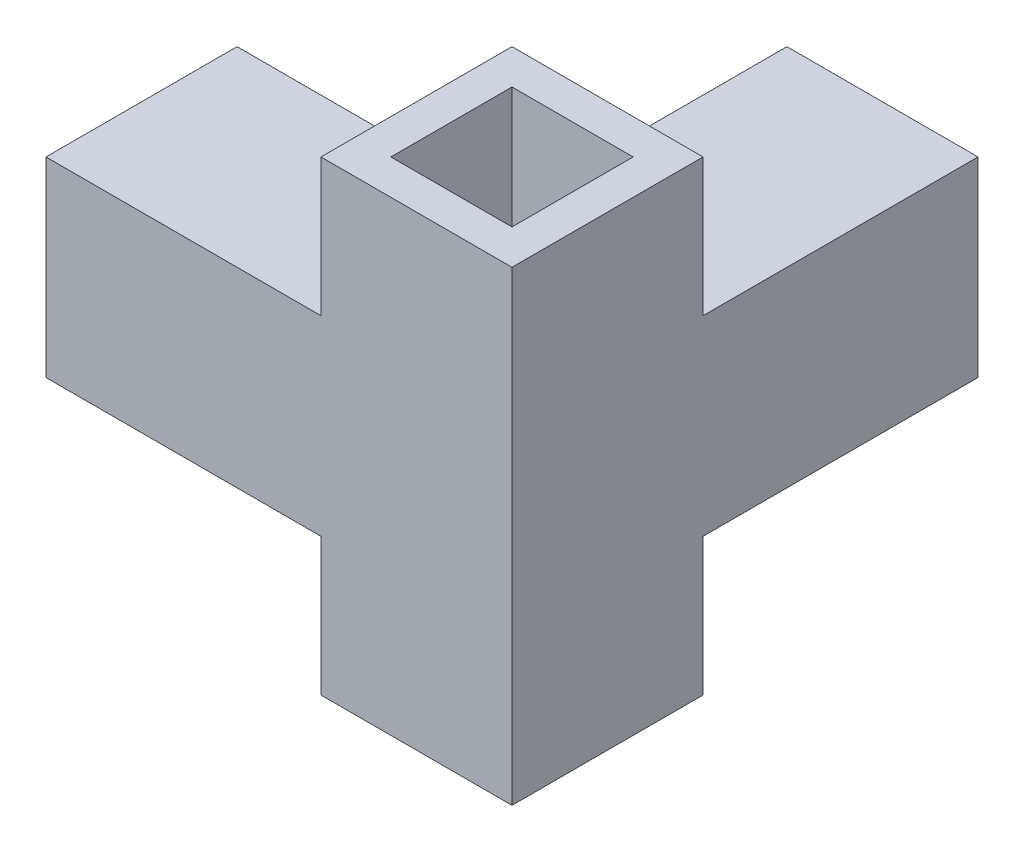
ISO-10303-21;
HEADER;
FILE_DESCRIPTION(('STEP AP214'),'2;1');
FILE_NAME('part.step','',(''),(''),'','','');
FILE_SCHEMA(('AUTOMOTIVE_DESIGN { 1 0 10303 214 1 1 1 1 }'));
ENDSEC;
DATA;
#1=APPLICATION_CONTEXT('core data for automotive mechanical design processes');
#2=APPLICATION_PROTOCOL_DEFINITION('international standard','automotive_design',2000,#1);
#3=PRODUCT_CONTEXT('',#1,'mechanical');
#4=PRODUCT('Part','Part','',(#3));
#5=PRODUCT_RELATED_PRODUCT_CATEGORY('part','',(#4));
#6=PRODUCT_DEFINITION_FORMATION('','',#4);
#7=PRODUCT_DEFINITION_CONTEXT('part definition',#1,'design');
#8=PRODUCT_DEFINITION('design','',#6,#7);
#9=PRODUCT_DEFINITION_SHAPE('','',#8);
#10=(LENGTH_UNIT() NAMED_UNIT(*) SI_UNIT(.MILLI.,.METRE.));
#11=(NAMED_UNIT(*) PLANE_ANGLE_UNIT() SI_UNIT($,.RADIAN.));
#12=(NAMED_UNIT(*) SI_UNIT($,.STERADIAN.) SOLID_ANGLE_UNIT());
#13=UNCERTAINTY_MEASURE_WITH_UNIT(LENGTH_MEASURE(1.E-05),#10,'distance_accuracy_value','');
#14=(GEOMETRIC_REPRESENTATION_CONTEXT(3) GLOBAL_UNCERTAINTY_ASSIGNED_CONTEXT((#13)) GLOBAL_UNIT_ASSIGNED_CONTEXT((#10,
#11,#12)) REPRESENTATION_CONTEXT('',''));
#15=CARTESIAN_POINT('',(0.,0.,0.));
#16=DIRECTION('',(0.,0.,1.));
#17=DIRECTION('',(1.,0.,0.));
#18=AXIS2_PLACEMENT_3D('',#15,#16,#17);
#19=CARTESIAN_POINT('',(0.,0.,0.));
#20=DIRECTION('',(-1.,0.,0.));
#21=DIRECTION('',(0.,0.,1.));
#22=AXIS2_PLACEMENT_3D('',#19,#20,#21);
#23=PLANE('',#22);
#24=DIRECTION('',(0.,0.,-1.));
#25=VECTOR('',#24,1.);
#26=CARTESIAN_POINT('',(0.,4.1,-8.2));
#27=LINE('',#26,#25);
#28=CARTESIAN_POINT('',(0.,4.1,0.));
#29=VERTEX_POINT('',#28);
#30=CARTESIAN_POINT('',(0.,4.1,-8.2));
#31=VERTEX_POINT('',#30);
#32=EDGE_CURVE('E69',#29,#31,#27,.T.);
#33=ORIENTED_EDGE('',*,*,#32,.F.);
#34=DIRECTION('',(0.,-1.,0.));
#35=VECTOR('',#34,1.);
#36=CARTESIAN_POINT('',(0.,10.,0.));
#37=LINE('',#36,#35);
#38=CARTESIAN_POINT('',(0.,10.,0.));
#39=VERTEX_POINT('',#38);
#40=EDGE_CURVE('E421',#39,#29,#37,.T.);
#41=ORIENTED_EDGE('',*,*,#40,.F.);
#42=DIRECTION('',(0.,0.,-1.));
#43=VECTOR('',#42,1.);
#44=CARTESIAN_POINT('',(0.,10.,0.));
#45=LINE('',#44,#43);
#46=CARTESIAN_POINT('',(0.,10.,-8.2));
#47=VERTEX_POINT('',#46);
#48=EDGE_CURVE('E416',#39,#47,#45,.T.);
#49=ORIENTED_EDGE('',*,*,#48,.T.);
#50=DIRECTION('',(0.,-1.,0.));
#51=VECTOR('',#50,1.);
#52=CARTESIAN_POINT('',(0.,10.,-8.2));
#53=LINE('',#52,#51);
#54=EDGE_CURVE('E413',#47,#31,#53,.T.);
#55=ORIENTED_EDGE('',*,*,#54,.T.);
#56=EDGE_LOOP('',(#33,#41,#49,#55));
#57=FACE_BOUND('',#56,.T.);
#58=ADVANCED_FACE('F45',(#57),#23,.T.);
#59=DIRECTION('',(0.,-1.,0.));
#60=VECTOR('',#59,1.);
#61=CARTESIAN_POINT('',(0.,4.1,-8.2));
#62=LINE('',#61,#60);
#63=CARTESIAN_POINT('',(0.,-4.1,-8.2));
#64=VERTEX_POINT('',#63);
#65=EDGE_CURVE('E243',#31,#64,#62,.T.);
#66=ORIENTED_EDGE('',*,*,#65,.F.);
#67=DIRECTION('',(0.,0.,-1.));
#68=VECTOR('',#67,1.);
#69=CARTESIAN_POINT('',(0.,4.1,-8.2));
#70=LINE('',#69,#68);
#71=CARTESIAN_POINT('',(0.,4.1,-20.));
#72=VERTEX_POINT('',#71);
#73=EDGE_CURVE('E409',#31,#72,#70,.T.);
#74=ORIENTED_EDGE('',*,*,#73,.T.);
#75=DIRECTION('',(0.,-1.,0.));
#76=VECTOR('',#75,1.);
#77=CARTESIAN_POINT('',(0.,4.1,-20.));
#78=LINE('',#77,#76);
#79=CARTESIAN_POINT('',(0.,-4.1,-20.));
#80=VERTEX_POINT('',#79);
#81=EDGE_CURVE('E405',#72,#80,#78,.T.);
#82=ORIENTED_EDGE('',*,*,#81,.T.);
#83=DIRECTION('',(0.,0.,-1.));
#84=VECTOR('',#83,1.);
#85=CARTESIAN_POINT('',(0.,-4.1,-8.2));
#86=LINE('',#85,#84);
#87=EDGE_CURVE('E339',#64,#80,#86,.T.);
#88=ORIENTED_EDGE('',*,*,#87,.F.);
#89=EDGE_LOOP('',(#66,#74,#82,#88));
#90=FACE_BOUND('',#89,.T.);
#91=ADVANCED_FACE('F463',(#90),#23,.T.);
#92=CARTESIAN_POINT('',(8.2,4.1,-20.));
#93=DIRECTION('',(0.,0.,-1.));
#94=DIRECTION('',(-1.,0.,0.));
#95=AXIS2_PLACEMENT_3D('',#92,#93,#94);
#96=PLANE('',#95);
#97=ORIENTED_EDGE('',*,*,#81,.F.);
#98=DIRECTION('',(-1.,0.,0.));
#99=VECTOR('',#98,1.);
#100=CARTESIAN_POINT('',(8.2,4.1,-20.));
#101=LINE('',#100,#99);
#102=CARTESIAN_POINT('',(8.2,4.1,-20.));
#103=VERTEX_POINT('',#102);
#104=EDGE_CURVE('E54',#103,#72,#101,.T.);
#105=ORIENTED_EDGE('',*,*,#104,.F.);
#106=DIRECTION('',(0.,-1.,0.));
#107=VECTOR('',#106,1.);
#108=CARTESIAN_POINT('',(8.2,4.1,-20.));
#109=LINE('',#108,#107);
#110=CARTESIAN_POINT('',(8.2,-4.1,-20.));
#111=VERTEX_POINT('',#110);
#112=EDGE_CURVE('E374',#103,#111,#109,.T.);
#113=ORIENTED_EDGE('',*,*,#112,.T.);
#114=DIRECTION('',(-1.,0.,0.));
#115=VECTOR('',#114,1.);
#116=CARTESIAN_POINT('',(8.2,-4.1,-20.));
#117=LINE('',#116,#115);
#118=EDGE_CURVE('E11',#111,#80,#117,.T.);
#119=ORIENTED_EDGE('',*,*,#118,.T.);
#120=EDGE_LOOP('',(#97,#105,#113,#119));
#121=FACE_BOUND('',#120,.T.);
#122=DIRECTION('',(-1.,0.,0.));
#123=VECTOR('',#122,1.);
#124=CARTESIAN_POINT('',(8.2,2.6,-20.));
#125=LINE('',#124,#123);
#126=CARTESIAN_POINT('',(6.7,2.6,-20.));
#127=VERTEX_POINT('',#126);
#128=CARTESIAN_POINT('',(1.5,2.6,-20.));
#129=VERTEX_POINT('',#128);
#130=EDGE_CURVE('E327',#127,#129,#125,.T.);
#131=ORIENTED_EDGE('',*,*,#130,.T.);
#132=DIRECTION('',(0.,-1.,0.));
#133=VECTOR('',#132,1.);
#134=CARTESIAN_POINT('',(1.5,0.,-20.));
#135=LINE('',#134,#133);
#136=CARTESIAN_POINT('',(1.5,-2.6,-20.));
#137=VERTEX_POINT('',#136);
#138=EDGE_CURVE('E286',#129,#137,#135,.T.);
#139=ORIENTED_EDGE('',*,*,#138,.T.);
#140=DIRECTION('',(-1.,0.,0.));
#141=VECTOR('',#140,1.);
#142=CARTESIAN_POINT('',(8.2,-2.6,-20.));
#143=LINE('',#142,#141);
#144=CARTESIAN_POINT('',(6.7,-2.6,-20.));
#145=VERTEX_POINT('',#144);
#146=EDGE_CURVE('E336',#145,#137,#143,.T.);
#147=ORIENTED_EDGE('',*,*,#146,.F.);
#148=DIRECTION('',(0.,-1.,0.));
#149=VECTOR('',#148,1.);
#150=CARTESIAN_POINT('',(6.7,0.,-20.));
#151=LINE('',#150,#149);
#152=EDGE_CURVE('E291',#127,#145,#151,.T.);
#153=ORIENTED_EDGE('',*,*,#152,.F.);
#154=EDGE_LOOP('',(#131,#139,#147,#153));
#155=FACE_BOUND('',#154,.T.);
#156=ADVANCED_FACE('F458',(#121,#155),#96,.T.);
#157=CARTESIAN_POINT('',(8.2,10.,0.));
#158=DIRECTION('',(0.,1.,0.));
#159=DIRECTION('',(0.,0.,1.));
#160=AXIS2_PLACEMENT_3D('',#157,#158,#159);
#161=PLANE('',#160);
#162=ORIENTED_EDGE('',*,*,#48,.F.);
#163=DIRECTION('',(-1.,0.,0.));
#164=VECTOR('',#163,1.);
#165=CARTESIAN_POINT('',(8.2,10.,0.));
#166=LINE('',#165,#164);
#167=CARTESIAN_POINT('',(8.2,10.,0.));
#168=VERTEX_POINT('',#167);
#169=EDGE_CURVE('E441',#168,#39,#166,.T.);
#170=ORIENTED_EDGE('',*,*,#169,.F.);
#171=DIRECTION('',(0.,0.,-1.));
#172=VECTOR('',#171,1.);
#173=CARTESIAN_POINT('',(8.2,10.,0.));
#174=LINE('',#173,#172);
#175=CARTESIAN_POINT('',(8.2,10.,-8.2));
#176=VERTEX_POINT('',#175);
#177=EDGE_CURVE('E387',#168,#176,#174,.T.);
#178=ORIENTED_EDGE('',*,*,#177,.T.);
#179=DIRECTION('',(-1.,0.,0.));
#180=VECTOR('',#179,1.);
#181=CARTESIAN_POINT('',(8.2,10.,-8.2));
#182=LINE('',#181,#180);
#183=EDGE_CURVE('E444',#176,#47,#182,.T.);
#184=ORIENTED_EDGE('',*,*,#183,.T.);
#185=EDGE_LOOP('',(#162,#170,#178,#184));
#186=FACE_BOUND('',#185,.T.);
#187=DIRECTION('',(-1.,0.,0.));
#188=VECTOR('',#187,1.);
#189=CARTESIAN_POINT('',(8.2,10.,-1.5));
#190=LINE('',#189,#188);
#191=CARTESIAN_POINT('',(6.7,10.,-1.5));
#192=VERTEX_POINT('',#191);
#193=CARTESIAN_POINT('',(1.5,10.,-1.5));
#194=VERTEX_POINT('',#193);
#195=EDGE_CURVE('E358',#192,#194,#190,.T.);
#196=ORIENTED_EDGE('',*,*,#195,.T.);
#197=DIRECTION('',(0.,0.,-1.));
#198=VECTOR('',#197,1.);
#199=CARTESIAN_POINT('',(1.5,10.,0.));
#200=LINE('',#199,#198);
#201=CARTESIAN_POINT('',(1.5,10.,-6.7));
#202=VERTEX_POINT('',#201);
#203=EDGE_CURVE('E332',#194,#202,#200,.T.);
#204=ORIENTED_EDGE('',*,*,#203,.T.);
#205=DIRECTION('',(-1.,0.,0.));
#206=VECTOR('',#205,1.);
#207=CARTESIAN_POINT('',(8.2,10.,-6.7));
#208=LINE('',#207,#206);
#209=CARTESIAN_POINT('',(6.7,10.,-6.7));
#210=VERTEX_POINT('',#209);
#211=EDGE_CURVE('E328',#210,#202,#208,.T.);
#212=ORIENTED_EDGE('',*,*,#211,.F.);
#213=DIRECTION('',(0.,0.,-1.));
#214=VECTOR('',#213,1.);
#215=CARTESIAN_POINT('',(6.7,10.,0.));
#216=LINE('',#215,#214);
#217=EDGE_CURVE('E314',#192,#210,#216,.T.);
#218=ORIENTED_EDGE('',*,*,#217,.F.);
#219=EDGE_LOOP('',(#196,#204,#212,#218));
#220=FACE_BOUND('',#219,.T.);
#221=ADVANCED_FACE('F498',(#186,#220),#161,.T.);
#222=CARTESIAN_POINT('',(8.2,-10.,0.));
#223=DIRECTION('',(0.,1.,0.));
#224=DIRECTION('',(0.,0.,1.));
#225=AXIS2_PLACEMENT_3D('',#222,#223,#224);
#226=PLANE('',#225);
#227=DIRECTION('',(0.,0.,-1.));
#228=VECTOR('',#227,1.);
#229=CARTESIAN_POINT('',(0.,-10.,0.));
#230=LINE('',#229,#228);
#231=CARTESIAN_POINT('',(0.,-10.,0.));
#232=VERTEX_POINT('',#231);
#233=CARTESIAN_POINT('',(0.,-10.,-8.2));
#234=VERTEX_POINT('',#233);
#235=EDGE_CURVE('E424',#232,#234,#230,.T.);
#236=ORIENTED_EDGE('',*,*,#235,.T.);
#237=DIRECTION('',(-1.,0.,0.));
#238=VECTOR('',#237,1.);
#239=CARTESIAN_POINT('',(8.2,-10.,-8.2));
#240=LINE('',#239,#238);
#241=CARTESIAN_POINT('',(8.2,-10.,-8.2));
#242=VERTEX_POINT('',#241);
#243=EDGE_CURVE('E434',#242,#234,#240,.T.);
#244=ORIENTED_EDGE('',*,*,#243,.F.);
#245=DIRECTION('',(0.,0.,-1.));
#246=VECTOR('',#245,1.);
#247=CARTESIAN_POINT('',(8.2,-10.,0.));
#248=LINE('',#247,#246);
#249=CARTESIAN_POINT('',(8.2,-10.,0.));
#250=VERTEX_POINT('',#249);
#251=EDGE_CURVE('E394',#250,#242,#248,.T.);
#252=ORIENTED_EDGE('',*,*,#251,.F.);
#253=DIRECTION('',(-1.,0.,0.));
#254=VECTOR('',#253,1.);
#255=CARTESIAN_POINT('',(8.2,-10.,0.));
#256=LINE('',#255,#254);
#257=EDGE_CURVE('E437',#250,#232,#256,.T.);
#258=ORIENTED_EDGE('',*,*,#257,.T.);
#259=EDGE_LOOP('',(#236,#244,#252,#258));
#260=FACE_BOUND('',#259,.T.);
#261=DIRECTION('',(0.,0.,-1.));
#262=VECTOR('',#261,1.);
#263=CARTESIAN_POINT('',(1.5,-10.,0.));
#264=LINE('',#263,#262);
#265=CARTESIAN_POINT('',(1.5,-10.,-1.5));
#266=VERTEX_POINT('',#265);
#267=CARTESIAN_POINT('',(1.5,-10.,-6.7));
#268=VERTEX_POINT('',#267);
#269=EDGE_CURVE('E301',#266,#268,#264,.T.);
#270=ORIENTED_EDGE('',*,*,#269,.F.);
#271=DIRECTION('',(-1.,0.,0.));
#272=VECTOR('',#271,1.);
#273=CARTESIAN_POINT('',(8.2,-10.,-1.5));
#274=LINE('',#273,#272);
#275=CARTESIAN_POINT('',(6.7,-10.,-1.5));
#276=VERTEX_POINT('',#275);
#277=EDGE_CURVE('E351',#276,#266,#274,.T.);
#278=ORIENTED_EDGE('',*,*,#277,.F.);
#279=DIRECTION('',(0.,0.,-1.));
#280=VECTOR('',#279,1.);
#281=CARTESIAN_POINT('',(6.7,-10.,0.));
#282=LINE('',#281,#280);
#283=CARTESIAN_POINT('',(6.7,-10.,-6.7));
#284=VERTEX_POINT('',#283);
#285=EDGE_CURVE('E305',#276,#284,#282,.T.);
#286=ORIENTED_EDGE('',*,*,#285,.T.);
#287=DIRECTION('',(-1.,0.,0.));
#288=VECTOR('',#287,1.);
#289=CARTESIAN_POINT('',(8.2,-10.,-6.7));
#290=LINE('',#289,#288);
#291=EDGE_CURVE('E296',#284,#268,#290,.T.);
#292=ORIENTED_EDGE('',*,*,#291,.T.);
#293=EDGE_LOOP('',(#270,#278,#286,#292));
#294=FACE_BOUND('',#293,.T.);
#295=ADVANCED_FACE('F503',(#260,#294),#226,.F.);
#296=CARTESIAN_POINT('',(8.2,-4.1,-8.2));
#297=DIRECTION('',(0.,1.,0.));
#298=DIRECTION('',(0.,0.,1.));
#299=AXIS2_PLACEMENT_3D('',#296,#297,#298);
#300=PLANE('',#299);
#301=ORIENTED_EDGE('',*,*,#87,.T.);
#302=ORIENTED_EDGE('',*,*,#118,.F.);
#303=DIRECTION('',(0.,0.,-1.));
#304=VECTOR('',#303,1.);
#305=CARTESIAN_POINT('',(8.2,-4.1,-8.2));
#306=LINE('',#305,#304);
#307=CARTESIAN_POINT('',(8.2,-4.1,-8.2));
#308=VERTEX_POINT('',#307);
#309=EDGE_CURVE('E371',#308,#111,#306,.T.);
#310=ORIENTED_EDGE('',*,*,#309,.F.);
#311=DIRECTION('',(-1.,0.,0.));
#312=VECTOR('',#311,1.);
#313=CARTESIAN_POINT('',(8.2,-4.1,-8.2));
#314=LINE('',#313,#312);
#315=EDGE_CURVE('E401',#308,#64,#314,.T.);
#316=ORIENTED_EDGE('',*,*,#315,.T.);
#317=EDGE_LOOP('',(#301,#302,#310,#316));
#318=FACE_BOUND('',#317,.T.);
#319=ADVANCED_FACE('F47',(#318),#300,.F.);
#320=CARTESIAN_POINT('',(8.2,4.1,-8.2));
#321=DIRECTION('',(0.,1.,0.));
#322=DIRECTION('',(0.,0.,1.));
#323=AXIS2_PLACEMENT_3D('',#320,#321,#322);
#324=PLANE('',#323);
#325=ORIENTED_EDGE('',*,*,#73,.F.);
#326=DIRECTION('',(-1.,0.,0.));
#327=VECTOR('',#326,1.);
#328=CARTESIAN_POINT('',(8.2,4.1,-8.2));
#329=LINE('',#328,#327);
#330=CARTESIAN_POINT('',(8.2,4.1,-8.2));
#331=VERTEX_POINT('',#330);
#332=EDGE_CURVE('E447',#331,#31,#329,.T.);
#333=ORIENTED_EDGE('',*,*,#332,.F.);
#334=DIRECTION('',(0.,0.,-1.));
#335=VECTOR('',#334,1.);
#336=CARTESIAN_POINT('',(8.2,4.1,-8.2));
#337=LINE('',#336,#335);
#338=EDGE_CURVE('E379',#331,#103,#337,.T.);
#339=ORIENTED_EDGE('',*,*,#338,.T.);
#340=ORIENTED_EDGE('',*,*,#104,.T.);
#341=EDGE_LOOP('',(#325,#333,#339,#340));
#342=FACE_BOUND('',#341,.T.);
#343=ADVANCED_FACE('F454',(#342),#324,.T.);
#344=CARTESIAN_POINT('',(8.2,10.,-8.2));
#345=DIRECTION('',(0.,0.,-1.));
#346=DIRECTION('',(0.,1.,0.));
#347=AXIS2_PLACEMENT_3D('',#344,#345,#346);
#348=PLANE('',#347);
#349=ORIENTED_EDGE('',*,*,#54,.F.);
#350=ORIENTED_EDGE('',*,*,#183,.F.);
#351=DIRECTION('',(0.,-1.,0.));
#352=VECTOR('',#351,1.);
#353=CARTESIAN_POINT('',(8.2,10.,-8.2));
#354=LINE('',#353,#352);
#355=EDGE_CURVE('E383',#176,#331,#354,.T.);
#356=ORIENTED_EDGE('',*,*,#355,.T.);
#357=ORIENTED_EDGE('',*,*,#332,.T.);
#358=EDGE_LOOP('',(#349,#350,#356,#357));
#359=FACE_BOUND('',#358,.T.);
#360=ADVANCED_FACE('F469',(#359),#348,.T.);
#361=CARTESIAN_POINT('',(8.2,10.,0.));
#362=DIRECTION('',(0.,0.,-1.));
#363=DIRECTION('',(-1.,0.,0.));
#364=AXIS2_PLACEMENT_3D('',#361,#362,#363);
#365=PLANE('',#364);
#366=ORIENTED_EDGE('',*,*,#40,.T.);
#367=DIRECTION('',(1.,0.,0.));
#368=VECTOR('',#367,1.);
#369=CARTESIAN_POINT('',(-11.8,4.1,0.));
#370=LINE('',#369,#368);
#371=CARTESIAN_POINT('',(-11.8,4.1,0.));
#372=VERTEX_POINT('',#371);
#373=EDGE_CURVE('E270',#372,#29,#370,.T.);
#374=ORIENTED_EDGE('',*,*,#373,.F.);
#375=DIRECTION('',(0.,1.,0.));
#376=VECTOR('',#375,1.);
#377=CARTESIAN_POINT('',(-11.8,4.1,0.));
#378=LINE('',#377,#376);
#379=CARTESIAN_POINT('',(-11.8,-4.1,0.));
#380=VERTEX_POINT('',#379);
#381=EDGE_CURVE('E251',#380,#372,#378,.T.);
#382=ORIENTED_EDGE('',*,*,#381,.F.);
#383=DIRECTION('',(1.,0.,0.));
#384=VECTOR('',#383,1.);
#385=CARTESIAN_POINT('',(-11.8,-4.1,0.));
#386=LINE('',#385,#384);
#387=CARTESIAN_POINT('',(0.,-4.1,0.));
#388=VERTEX_POINT('',#387);
#389=EDGE_CURVE('E274',#380,#388,#386,.T.);
#390=ORIENTED_EDGE('',*,*,#389,.T.);
#391=EDGE_CURVE('E420',#388,#232,#37,.T.);
#392=ORIENTED_EDGE('',*,*,#391,.T.);
#393=ORIENTED_EDGE('',*,*,#257,.F.);
#394=DIRECTION('',(0.,-1.,0.));
#395=VECTOR('',#394,1.);
#396=CARTESIAN_POINT('',(8.2,10.,0.));
#397=LINE('',#396,#395);
#398=EDGE_CURVE('E391',#168,#250,#397,.T.);
#399=ORIENTED_EDGE('',*,*,#398,.F.);
#400=ORIENTED_EDGE('',*,*,#169,.T.);
#401=EDGE_LOOP('',(#366,#374,#382,#390,#392,#393,#399,#400));
#402=FACE_BOUND('',#401,.T.);
#403=ADVANCED_FACE('F494',(#402),#365,.F.);
#404=CARTESIAN_POINT('',(8.2,-4.1,-8.2));
#405=DIRECTION('',(0.,0.,-1.));
#406=DIRECTION('',(-1.,0.,0.));
#407=AXIS2_PLACEMENT_3D('',#404,#405,#406);
#408=PLANE('',#407);
#409=DIRECTION('',(0.,-1.,0.));
#410=VECTOR('',#409,1.);
#411=CARTESIAN_POINT('',(0.,-4.1,-8.2));
#412=LINE('',#411,#410);
#413=EDGE_CURVE('E375',#64,#234,#412,.T.);
#414=ORIENTED_EDGE('',*,*,#413,.F.);
#415=ORIENTED_EDGE('',*,*,#315,.F.);
#416=DIRECTION('',(0.,-1.,0.));
#417=VECTOR('',#416,1.);
#418=CARTESIAN_POINT('',(8.2,-4.1,-8.2));
#419=LINE('',#418,#417);
#420=EDGE_CURVE('E397',#308,#242,#419,.T.);
#421=ORIENTED_EDGE('',*,*,#420,.T.);
#422=ORIENTED_EDGE('',*,*,#243,.T.);
#423=EDGE_LOOP('',(#414,#415,#421,#422));
#424=FACE_BOUND('',#423,.T.);
#425=ADVANCED_FACE('F478',(#424),#408,.T.);
#426=CARTESIAN_POINT('',(8.2,0.,0.));
#427=DIRECTION('',(-1.,0.,0.));
#428=DIRECTION('',(0.,0.,1.));
#429=AXIS2_PLACEMENT_3D('',#426,#427,#428);
#430=PLANE('',#429);
#431=ORIENTED_EDGE('',*,*,#309,.T.);
#432=ORIENTED_EDGE('',*,*,#112,.F.);
#433=ORIENTED_EDGE('',*,*,#338,.F.);
#434=ORIENTED_EDGE('',*,*,#355,.F.);
#435=ORIENTED_EDGE('',*,*,#177,.F.);
#436=ORIENTED_EDGE('',*,*,#398,.T.);
#437=ORIENTED_EDGE('',*,*,#251,.T.);
#438=ORIENTED_EDGE('',*,*,#420,.F.);
#439=EDGE_LOOP('',(#431,#432,#433,#434,#435,#436,#437,#438));
#440=FACE_BOUND('',#439,.T.);
#441=ADVANCED_FACE('F472',(#440),#430,.F.);
#442=DIRECTION('',(0.,0.,1.));
#443=VECTOR('',#442,1.);
#444=CARTESIAN_POINT('',(0.,-4.1,-8.2));
#445=LINE('',#444,#443);
#446=EDGE_CURVE('E261',#64,#388,#445,.T.);
#447=ORIENTED_EDGE('',*,*,#446,.F.);
#448=ORIENTED_EDGE('',*,*,#413,.T.);
#449=ORIENTED_EDGE('',*,*,#235,.F.);
#450=ORIENTED_EDGE('',*,*,#391,.F.);
#451=EDGE_LOOP('',(#447,#448,#449,#450));
#452=FACE_BOUND('',#451,.T.);
#453=ADVANCED_FACE('F505',(#452),#23,.T.);
#454=CARTESIAN_POINT('',(8.2,-2.6,-8.2));
#455=DIRECTION('',(0.,1.,0.));
#456=DIRECTION('',(0.,0.,1.));
#457=AXIS2_PLACEMENT_3D('',#454,#455,#456);
#458=PLANE('',#457);
#459=DIRECTION('',(0.,0.,-1.));
#460=VECTOR('',#459,1.);
#461=CARTESIAN_POINT('',(1.5,-2.6,0.));
#462=LINE('',#461,#460);
#463=CARTESIAN_POINT('',(1.5,-2.6,-6.7));
#464=VERTEX_POINT('',#463);
#465=EDGE_CURVE('E282',#464,#137,#462,.T.);
#466=ORIENTED_EDGE('',*,*,#465,.F.);
#467=DIRECTION('',(-1.,0.,0.));
#468=VECTOR('',#467,1.);
#469=CARTESIAN_POINT('',(8.2,-2.6,-6.7));
#470=LINE('',#469,#468);
#471=CARTESIAN_POINT('',(6.7,-2.6,-6.7));
#472=VERTEX_POINT('',#471);
#473=EDGE_CURVE('E293',#472,#464,#470,.T.);
#474=ORIENTED_EDGE('',*,*,#473,.F.);
#475=DIRECTION('',(0.,0.,-1.));
#476=VECTOR('',#475,1.);
#477=CARTESIAN_POINT('',(6.7,-2.6,0.));
#478=LINE('',#477,#476);
#479=EDGE_CURVE('E287',#472,#145,#478,.T.);
#480=ORIENTED_EDGE('',*,*,#479,.T.);
#481=ORIENTED_EDGE('',*,*,#146,.T.);
#482=EDGE_LOOP('',(#466,#474,#480,#481));
#483=FACE_BOUND('',#482,.T.);
#484=ADVANCED_FACE('F543',(#483),#458,.T.);
#485=CARTESIAN_POINT('',(8.2,2.6,-8.2));
#486=DIRECTION('',(0.,1.,0.));
#487=DIRECTION('',(0.,0.,1.));
#488=AXIS2_PLACEMENT_3D('',#485,#486,#487);
#489=PLANE('',#488);
#490=DIRECTION('',(0.,0.,-1.));
#491=VECTOR('',#490,1.);
#492=CARTESIAN_POINT('',(1.5,2.6,0.));
#493=LINE('',#492,#491);
#494=CARTESIAN_POINT('',(1.5,2.6,-6.7));
#495=VERTEX_POINT('',#494);
#496=EDGE_CURVE('E319',#495,#129,#493,.T.);
#497=ORIENTED_EDGE('',*,*,#496,.T.);
#498=ORIENTED_EDGE('',*,*,#130,.F.);
#499=DIRECTION('',(0.,0.,-1.));
#500=VECTOR('',#499,1.);
#501=CARTESIAN_POINT('',(6.7,2.6,0.));
#502=LINE('',#501,#500);
#503=CARTESIAN_POINT('',(6.7,2.6,-6.7));
#504=VERTEX_POINT('',#503);
#505=EDGE_CURVE('E306',#504,#127,#502,.T.);
#506=ORIENTED_EDGE('',*,*,#505,.F.);
#507=DIRECTION('',(-1.,0.,0.));
#508=VECTOR('',#507,1.);
#509=CARTESIAN_POINT('',(8.2,2.6,-6.7));
#510=LINE('',#509,#508);
#511=EDGE_CURVE('E324',#504,#495,#510,.T.);
#512=ORIENTED_EDGE('',*,*,#511,.T.);
#513=EDGE_LOOP('',(#497,#498,#506,#512));
#514=FACE_BOUND('',#513,.T.);
#515=ADVANCED_FACE('F549',(#514),#489,.F.);
#516=CARTESIAN_POINT('',(8.2,10.,-6.7));
#517=DIRECTION('',(0.,0.,-1.));
#518=DIRECTION('',(0.,1.,0.));
#519=AXIS2_PLACEMENT_3D('',#516,#517,#518);
#520=PLANE('',#519);
#521=DIRECTION('',(0.,-1.,0.));
#522=VECTOR('',#521,1.);
#523=CARTESIAN_POINT('',(1.5,0.,-6.7));
#524=LINE('',#523,#522);
#525=EDGE_CURVE('E323',#202,#495,#524,.T.);
#526=ORIENTED_EDGE('',*,*,#525,.T.);
#527=ORIENTED_EDGE('',*,*,#511,.F.);
#528=DIRECTION('',(0.,-1.,0.));
#529=VECTOR('',#528,1.);
#530=CARTESIAN_POINT('',(6.7,0.,-6.7));
#531=LINE('',#530,#529);
#532=EDGE_CURVE('E310',#210,#504,#531,.T.);
#533=ORIENTED_EDGE('',*,*,#532,.F.);
#534=ORIENTED_EDGE('',*,*,#211,.T.);
#535=EDGE_LOOP('',(#526,#527,#533,#534));
#536=FACE_BOUND('',#535,.T.);
#537=ADVANCED_FACE('F571',(#536),#520,.F.);
#538=CARTESIAN_POINT('',(8.2,10.,-1.5));
#539=DIRECTION('',(0.,0.,-1.));
#540=DIRECTION('',(-1.,0.,0.));
#541=AXIS2_PLACEMENT_3D('',#538,#539,#540);
#542=PLANE('',#541);
#543=DIRECTION('',(0.,-1.,0.));
#544=VECTOR('',#543,1.);
#545=CARTESIAN_POINT('',(1.5,0.,-1.5));
#546=LINE('',#545,#544);
#547=EDGE_CURVE('E333',#194,#266,#546,.T.);
#548=ORIENTED_EDGE('',*,*,#547,.F.);
#549=ORIENTED_EDGE('',*,*,#195,.F.);
#550=DIRECTION('',(0.,-1.,0.));
#551=VECTOR('',#550,1.);
#552=CARTESIAN_POINT('',(6.7,0.,-1.5));
#553=LINE('',#552,#551);
#554=EDGE_CURVE('E315',#192,#276,#553,.T.);
#555=ORIENTED_EDGE('',*,*,#554,.T.);
#556=ORIENTED_EDGE('',*,*,#277,.T.);
#557=EDGE_LOOP('',(#548,#549,#555,#556));
#558=FACE_BOUND('',#557,.T.);
#559=ADVANCED_FACE('F567',(#558),#542,.T.);
#560=CARTESIAN_POINT('',(8.2,-4.1,-6.7));
#561=DIRECTION('',(0.,0.,-1.));
#562=DIRECTION('',(-1.,0.,0.));
#563=AXIS2_PLACEMENT_3D('',#560,#561,#562);
#564=PLANE('',#563);
#565=DIRECTION('',(0.,-1.,0.));
#566=VECTOR('',#565,1.);
#567=CARTESIAN_POINT('',(1.5,0.,-6.7));
#568=LINE('',#567,#566);
#569=EDGE_CURVE('E292',#464,#268,#568,.T.);
#570=ORIENTED_EDGE('',*,*,#569,.T.);
#571=ORIENTED_EDGE('',*,*,#291,.F.);
#572=DIRECTION('',(0.,-1.,0.));
#573=VECTOR('',#572,1.);
#574=CARTESIAN_POINT('',(6.7,0.,-6.7));
#575=LINE('',#574,#573);
#576=EDGE_CURVE('E297',#472,#284,#575,.T.);
#577=ORIENTED_EDGE('',*,*,#576,.F.);
#578=ORIENTED_EDGE('',*,*,#473,.T.);
#579=EDGE_LOOP('',(#570,#571,#577,#578));
#580=FACE_BOUND('',#579,.T.);
#581=ADVANCED_FACE('F563',(#580),#564,.F.);
#582=CARTESIAN_POINT('',(6.7,0.,0.));
#583=DIRECTION('',(-1.,0.,0.));
#584=DIRECTION('',(0.,0.,1.));
#585=AXIS2_PLACEMENT_3D('',#582,#583,#584);
#586=PLANE('',#585);
#587=ORIENTED_EDGE('',*,*,#479,.F.);
#588=ORIENTED_EDGE('',*,*,#576,.T.);
#589=ORIENTED_EDGE('',*,*,#285,.F.);
#590=ORIENTED_EDGE('',*,*,#554,.F.);
#591=ORIENTED_EDGE('',*,*,#217,.T.);
#592=ORIENTED_EDGE('',*,*,#532,.T.);
#593=ORIENTED_EDGE('',*,*,#505,.T.);
#594=ORIENTED_EDGE('',*,*,#152,.T.);
#595=EDGE_LOOP('',(#587,#588,#589,#590,#591,#592,#593,#594));
#596=FACE_BOUND('',#595,.T.);
#597=ADVANCED_FACE('F559',(#596),#586,.T.);
#598=CARTESIAN_POINT('',(1.5,0.,0.));
#599=DIRECTION('',(-1.,0.,0.));
#600=DIRECTION('',(0.,0.,1.));
#601=AXIS2_PLACEMENT_3D('',#598,#599,#600);
#602=PLANE('',#601);
#603=ORIENTED_EDGE('',*,*,#465,.T.);
#604=ORIENTED_EDGE('',*,*,#138,.F.);
#605=ORIENTED_EDGE('',*,*,#496,.F.);
#606=ORIENTED_EDGE('',*,*,#525,.F.);
#607=ORIENTED_EDGE('',*,*,#203,.F.);
#608=ORIENTED_EDGE('',*,*,#547,.T.);
#609=ORIENTED_EDGE('',*,*,#269,.T.);
#610=ORIENTED_EDGE('',*,*,#569,.F.);
#611=EDGE_LOOP('',(#603,#604,#605,#606,#607,#608,#609,#610));
#612=FACE_BOUND('',#611,.T.);
#613=ADVANCED_FACE('F557',(#612),#602,.F.);
#614=CARTESIAN_POINT('',(-11.8,4.1,-8.2));
#615=DIRECTION('',(0.,0.,1.));
#616=DIRECTION('',(0.,-1.,0.));
#617=AXIS2_PLACEMENT_3D('',#614,#615,#616);
#618=PLANE('',#617);
#619=ORIENTED_EDGE('',*,*,#65,.T.);
#620=DIRECTION('',(1.,0.,0.));
#621=VECTOR('',#620,1.);
#622=CARTESIAN_POINT('',(-11.8,-4.1,-8.2));
#623=LINE('',#622,#621);
#624=CARTESIAN_POINT('',(-11.8,-4.1,-8.2));
#625=VERTEX_POINT('',#624);
#626=EDGE_CURVE('E278',#625,#64,#623,.T.);
#627=ORIENTED_EDGE('',*,*,#626,.F.);
#628=DIRECTION('',(0.,-1.,0.));
#629=VECTOR('',#628,1.);
#630=CARTESIAN_POINT('',(-11.8,4.1,-8.2));
#631=LINE('',#630,#629);
#632=CARTESIAN_POINT('',(-11.8,4.1,-8.2));
#633=VERTEX_POINT('',#632);
#634=EDGE_CURVE('E244',#633,#625,#631,.T.);
#635=ORIENTED_EDGE('',*,*,#634,.F.);
#636=DIRECTION('',(1.,0.,0.));
#637=VECTOR('',#636,1.);
#638=CARTESIAN_POINT('',(-11.8,4.1,-8.2));
#639=LINE('',#638,#637);
#640=EDGE_CURVE('E257',#633,#31,#639,.T.);
#641=ORIENTED_EDGE('',*,*,#640,.T.);
#642=EDGE_LOOP('',(#619,#627,#635,#641));
#643=FACE_BOUND('',#642,.T.);
#644=ADVANCED_FACE('F486',(#643),#618,.F.);
#645=CARTESIAN_POINT('',(-11.8,-4.1,-8.2));
#646=DIRECTION('',(0.,1.,0.));
#647=DIRECTION('',(0.,0.,1.));
#648=AXIS2_PLACEMENT_3D('',#645,#646,#647);
#649=PLANE('',#648);
#650=ORIENTED_EDGE('',*,*,#446,.T.);
#651=ORIENTED_EDGE('',*,*,#389,.F.);
#652=DIRECTION('',(0.,0.,1.));
#653=VECTOR('',#652,1.);
#654=CARTESIAN_POINT('',(-11.8,-4.1,-8.2));
#655=LINE('',#654,#653);
#656=EDGE_CURVE('E248',#625,#380,#655,.T.);
#657=ORIENTED_EDGE('',*,*,#656,.F.);
#658=ORIENTED_EDGE('',*,*,#626,.T.);
#659=EDGE_LOOP('',(#650,#651,#657,#658));
#660=FACE_BOUND('',#659,.T.);
#661=ADVANCED_FACE('F483',(#660),#649,.F.);
#662=CARTESIAN_POINT('',(-11.8,4.1,-8.2));
#663=DIRECTION('',(0.,-1.,0.));
#664=DIRECTION('',(0.,0.,-1.));
#665=AXIS2_PLACEMENT_3D('',#662,#663,#664);
#666=PLANE('',#665);
#667=ORIENTED_EDGE('',*,*,#32,.T.);
#668=ORIENTED_EDGE('',*,*,#640,.F.);
#669=DIRECTION('',(0.,0.,-1.));
#670=VECTOR('',#669,1.);
#671=CARTESIAN_POINT('',(-11.8,4.1,-8.2));
#672=LINE('',#671,#670);
#673=EDGE_CURVE('E254',#372,#633,#672,.T.);
#674=ORIENTED_EDGE('',*,*,#673,.F.);
#675=ORIENTED_EDGE('',*,*,#373,.T.);
#676=EDGE_LOOP('',(#667,#668,#674,#675));
#677=FACE_BOUND('',#676,.T.);
#678=ADVANCED_FACE('F492',(#677),#666,.F.);
#679=CARTESIAN_POINT('',(-11.8,0.,0.));
#680=DIRECTION('',(-1.,0.,0.));
#681=DIRECTION('',(0.,0.,1.));
#682=AXIS2_PLACEMENT_3D('',#679,#680,#681);
#683=PLANE('',#682);
#684=DIRECTION('',(0.,-1.,0.));
#685=VECTOR('',#684,1.);
#686=CARTESIAN_POINT('',(-11.8,4.1,-6.7));
#687=LINE('',#686,#685);
#688=CARTESIAN_POINT('',(-11.8,2.6,-6.7));
#689=VERTEX_POINT('',#688);
#690=CARTESIAN_POINT('',(-11.8,-2.6,-6.7));
#691=VERTEX_POINT('',#690);
#692=EDGE_CURVE('E215',#689,#691,#687,.T.);
#693=ORIENTED_EDGE('',*,*,#692,.F.);
#694=DIRECTION('',(0.,0.,-1.));
#695=VECTOR('',#694,1.);
#696=CARTESIAN_POINT('',(-11.8,2.6,-8.2));
#697=LINE('',#696,#695);
#698=CARTESIAN_POINT('',(-11.8,2.6,-1.5));
#699=VERTEX_POINT('',#698);
#700=EDGE_CURVE('E201',#699,#689,#697,.T.);
#701=ORIENTED_EDGE('',*,*,#700,.F.);
#702=DIRECTION('',(0.,1.,0.));
#703=VECTOR('',#702,1.);
#704=CARTESIAN_POINT('',(-11.8,10.,-1.5));
#705=LINE('',#704,#703);
#706=CARTESIAN_POINT('',(-11.8,-2.6,-1.5));
#707=VERTEX_POINT('',#706);
#708=EDGE_CURVE('E209',#707,#699,#705,.T.);
#709=ORIENTED_EDGE('',*,*,#708,.F.);
#710=DIRECTION('',(0.,0.,1.));
#711=VECTOR('',#710,1.);
#712=CARTESIAN_POINT('',(-11.8,-2.6,-8.2));
#713=LINE('',#712,#711);
#714=EDGE_CURVE('E224',#691,#707,#713,.T.);
#715=ORIENTED_EDGE('',*,*,#714,.F.);
#716=EDGE_LOOP('',(#693,#701,#709,#715));
#717=FACE_BOUND('',#716,.T.);
#718=ORIENTED_EDGE('',*,*,#634,.T.);
#719=ORIENTED_EDGE('',*,*,#656,.T.);
#720=ORIENTED_EDGE('',*,*,#381,.T.);
#721=ORIENTED_EDGE('',*,*,#673,.T.);
#722=EDGE_LOOP('',(#718,#719,#720,#721));
#723=FACE_BOUND('',#722,.T.);
#724=ADVANCED_FACE('F222',(#717,#723),#683,.T.);
#725=CARTESIAN_POINT('',(0.,0.,0.));
#726=DIRECTION('',(-1.,0.,0.));
#727=DIRECTION('',(0.,0.,1.));
#728=AXIS2_PLACEMENT_3D('',#725,#726,#727);
#729=PLANE('',#728);
#730=DIRECTION('',(0.,0.,-1.));
#731=VECTOR('',#730,1.);
#732=CARTESIAN_POINT('',(0.,-2.6,0.));
#733=LINE('',#732,#731);
#734=CARTESIAN_POINT('',(0.,-2.6,-1.5));
#735=VERTEX_POINT('',#734);
#736=CARTESIAN_POINT('',(0.,-2.6,-6.7));
#737=VERTEX_POINT('',#736);
#738=EDGE_CURVE('E234',#735,#737,#733,.T.);
#739=ORIENTED_EDGE('',*,*,#738,.F.);
#740=DIRECTION('',(0.,-1.,0.));
#741=VECTOR('',#740,1.);
#742=CARTESIAN_POINT('',(0.,0.,-1.5));
#743=LINE('',#742,#741);
#744=CARTESIAN_POINT('',(0.,2.6,-1.5));
#745=VERTEX_POINT('',#744);
#746=EDGE_CURVE('E231',#745,#735,#743,.T.);
#747=ORIENTED_EDGE('',*,*,#746,.F.);
#748=DIRECTION('',(0.,0.,1.));
#749=VECTOR('',#748,1.);
#750=CARTESIAN_POINT('',(0.,2.6,0.));
#751=LINE('',#750,#749);
#752=CARTESIAN_POINT('',(0.,2.6,-6.7));
#753=VERTEX_POINT('',#752);
#754=EDGE_CURVE('E238',#753,#745,#751,.T.);
#755=ORIENTED_EDGE('',*,*,#754,.F.);
#756=DIRECTION('',(0.,1.,0.));
#757=VECTOR('',#756,1.);
#758=CARTESIAN_POINT('',(0.,0.,-6.7));
#759=LINE('',#758,#757);
#760=EDGE_CURVE('E218',#737,#753,#759,.T.);
#761=ORIENTED_EDGE('',*,*,#760,.F.);
#762=EDGE_LOOP('',(#739,#747,#755,#761));
#763=FACE_BOUND('',#762,.T.);
#764=ADVANCED_FACE('F524',(#763),#729,.T.);
#765=CARTESIAN_POINT('',(8.2,10.,-1.5));
#766=DIRECTION('',(0.,0.,-1.));
#767=DIRECTION('',(-1.,0.,0.));
#768=AXIS2_PLACEMENT_3D('',#765,#766,#767);
#769=PLANE('',#768);
#770=ORIENTED_EDGE('',*,*,#746,.T.);
#771=DIRECTION('',(1.,0.,0.));
#772=VECTOR('',#771,1.);
#773=CARTESIAN_POINT('',(8.2,-2.6,-1.5));
#774=LINE('',#773,#772);
#775=EDGE_CURVE('E509',#707,#735,#774,.T.);
#776=ORIENTED_EDGE('',*,*,#775,.F.);
#777=ORIENTED_EDGE('',*,*,#708,.T.);
#778=DIRECTION('',(1.,0.,0.));
#779=VECTOR('',#778,1.);
#780=CARTESIAN_POINT('',(-11.8,2.6,-1.5));
#781=LINE('',#780,#779);
#782=EDGE_CURVE('E61',#699,#745,#781,.T.);
#783=ORIENTED_EDGE('',*,*,#782,.T.);
#784=EDGE_LOOP('',(#770,#776,#777,#783));
#785=FACE_BOUND('',#784,.T.);
#786=ADVANCED_FACE('F518',(#785),#769,.T.);
#787=CARTESIAN_POINT('',(-11.8,4.1,-6.7));
#788=DIRECTION('',(0.,0.,1.));
#789=DIRECTION('',(0.,-1.,0.));
#790=AXIS2_PLACEMENT_3D('',#787,#788,#789);
#791=PLANE('',#790);
#792=ORIENTED_EDGE('',*,*,#760,.T.);
#793=DIRECTION('',(1.,0.,0.));
#794=VECTOR('',#793,1.);
#795=CARTESIAN_POINT('',(-11.8,2.6,-6.7));
#796=LINE('',#795,#794);
#797=EDGE_CURVE('E204',#689,#753,#796,.T.);
#798=ORIENTED_EDGE('',*,*,#797,.F.);
#799=ORIENTED_EDGE('',*,*,#692,.T.);
#800=DIRECTION('',(1.,0.,0.));
#801=VECTOR('',#800,1.);
#802=CARTESIAN_POINT('',(-11.8,-2.6,-6.7));
#803=LINE('',#802,#801);
#804=EDGE_CURVE('E235',#691,#737,#803,.T.);
#805=ORIENTED_EDGE('',*,*,#804,.T.);
#806=EDGE_LOOP('',(#792,#798,#799,#805));
#807=FACE_BOUND('',#806,.T.);
#808=ADVANCED_FACE('F213',(#807),#791,.T.);
#809=CARTESIAN_POINT('',(-11.8,-2.6,-8.2));
#810=DIRECTION('',(0.,1.,0.));
#811=DIRECTION('',(0.,0.,1.));
#812=AXIS2_PLACEMENT_3D('',#809,#810,#811);
#813=PLANE('',#812);
#814=ORIENTED_EDGE('',*,*,#738,.T.);
#815=ORIENTED_EDGE('',*,*,#804,.F.);
#816=ORIENTED_EDGE('',*,*,#714,.T.);
#817=ORIENTED_EDGE('',*,*,#775,.T.);
#818=EDGE_LOOP('',(#814,#815,#816,#817));
#819=FACE_BOUND('',#818,.T.);
#820=ADVANCED_FACE('F522',(#819),#813,.T.);
#821=CARTESIAN_POINT('',(-11.8,2.6,-8.2));
#822=DIRECTION('',(0.,-1.,0.));
#823=DIRECTION('',(0.,0.,-1.));
#824=AXIS2_PLACEMENT_3D('',#821,#822,#823);
#825=PLANE('',#824);
#826=ORIENTED_EDGE('',*,*,#754,.T.);
#827=ORIENTED_EDGE('',*,*,#782,.F.);
#828=ORIENTED_EDGE('',*,*,#700,.T.);
#829=ORIENTED_EDGE('',*,*,#797,.T.);
#830=EDGE_LOOP('',(#826,#827,#828,#829));
#831=FACE_BOUND('',#830,.T.);
#832=ADVANCED_FACE('F203',(#831),#825,.T.);
#833=CLOSED_SHELL('',(#58,#91,#156,#221,#295,#319,#343,#360,#403,#425,#441,#453,#484,#515,#537,
#559,#581,#597,#613,#644,#661,#678,#724,#764,#786,#808,#820,#832));
#834=MANIFOLD_SOLID_BREP('B2',#833);
#835=ADVANCED_BREP_SHAPE_REPRESENTATION('',(#18,#834),#14);
#836=SHAPE_DEFINITION_REPRESENTATION(#9,#835);
ENDSEC;
END-ISO-10303-21;
